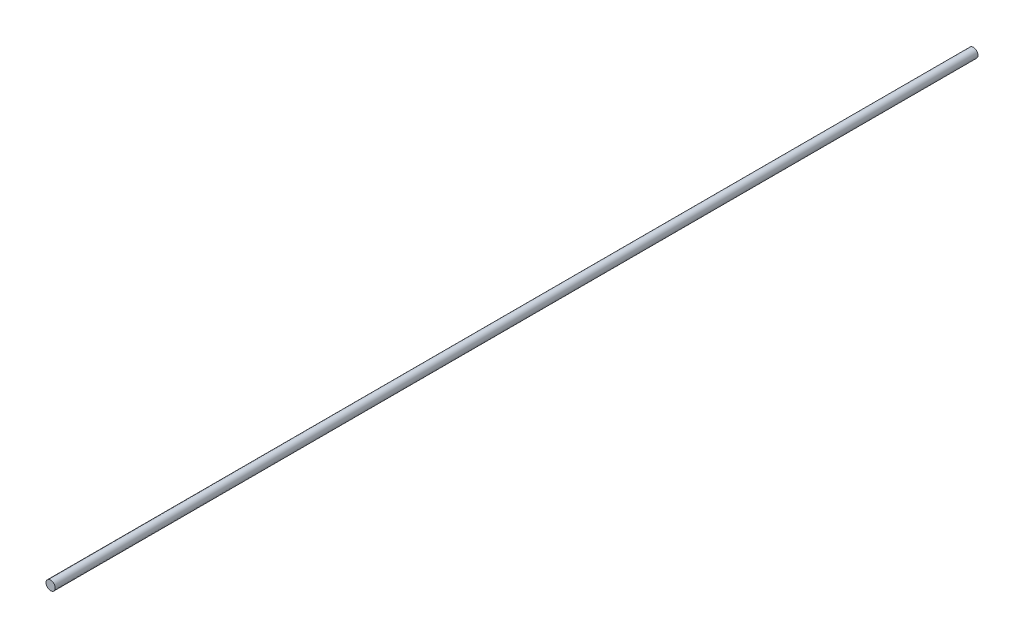
ISO-10303-21;
HEADER;
FILE_DESCRIPTION(('STEP AP214'),'2;1');
FILE_NAME('part.step','',(''),(''),'','','');
FILE_SCHEMA(('AUTOMOTIVE_DESIGN { 1 0 10303 214 1 1 1 1 }'));
ENDSEC;
DATA;
#1=APPLICATION_CONTEXT('core data for automotive mechanical design processes');
#2=APPLICATION_PROTOCOL_DEFINITION('international standard','automotive_design',2000,#1);
#3=PRODUCT_CONTEXT('',#1,'mechanical');
#4=PRODUCT('Part','Part','',(#3));
#5=PRODUCT_RELATED_PRODUCT_CATEGORY('part','',(#4));
#6=PRODUCT_DEFINITION_FORMATION('','',#4);
#7=PRODUCT_DEFINITION_CONTEXT('part definition',#1,'design');
#8=PRODUCT_DEFINITION('design','',#6,#7);
#9=PRODUCT_DEFINITION_SHAPE('','',#8);
#10=(LENGTH_UNIT() NAMED_UNIT(*) SI_UNIT(.MILLI.,.METRE.));
#11=(NAMED_UNIT(*) PLANE_ANGLE_UNIT() SI_UNIT($,.RADIAN.));
#12=(NAMED_UNIT(*) SI_UNIT($,.STERADIAN.) SOLID_ANGLE_UNIT());
#13=UNCERTAINTY_MEASURE_WITH_UNIT(LENGTH_MEASURE(1.E-05),#10,'distance_accuracy_value','');
#14=(GEOMETRIC_REPRESENTATION_CONTEXT(3) GLOBAL_UNCERTAINTY_ASSIGNED_CONTEXT((#13)) GLOBAL_UNIT_ASSIGNED_CONTEXT((#10,
#11,#12)) REPRESENTATION_CONTEXT('',''));
#15=CARTESIAN_POINT('',(0.,0.,0.));
#16=DIRECTION('',(0.,0.,1.));
#17=DIRECTION('',(1.,0.,0.));
#18=AXIS2_PLACEMENT_3D('',#15,#16,#17);
#19=CARTESIAN_POINT('',(0.,0.,300.));
#20=DIRECTION('',(0.,0.,-1.));
#21=DIRECTION('',(-1.,0.,0.));
#22=AXIS2_PLACEMENT_3D('',#19,#20,#21);
#23=CYLINDRICAL_SURFACE('',#22,1.5);
#24=CARTESIAN_POINT('',(0.,0.,300.));
#25=DIRECTION('',(0.,0.,1.));
#26=DIRECTION('',(1.,0.,0.));
#27=AXIS2_PLACEMENT_3D('',#24,#25,#26);
#28=CIRCLE('',#27,1.5);
#29=CARTESIAN_POINT('',(1.5,0.,300.));
#30=VERTEX_POINT('',#29);
#31=EDGE_CURVE('E10',#30,#30,#28,.T.);
#32=ORIENTED_EDGE('',*,*,#31,.F.);
#33=EDGE_LOOP('',(#32));
#34=FACE_BOUND('',#33,.T.);
#35=CARTESIAN_POINT('',(0.,0.,0.));
#36=DIRECTION('',(0.,0.,1.));
#37=DIRECTION('',(1.,0.,0.));
#38=AXIS2_PLACEMENT_3D('',#35,#36,#37);
#39=CIRCLE('',#38,1.5);
#40=CARTESIAN_POINT('',(1.5,0.,0.));
#41=VERTEX_POINT('',#40);
#42=EDGE_CURVE('E42',#41,#41,#39,.T.);
#43=ORIENTED_EDGE('',*,*,#42,.T.);
#44=EDGE_LOOP('',(#43));
#45=FACE_BOUND('',#44,.T.);
#46=ADVANCED_FACE('F39',(#34,#45),#23,.T.);
#47=CARTESIAN_POINT('',(0.,0.,300.));
#48=DIRECTION('',(0.,0.,1.));
#49=DIRECTION('',(1.,0.,0.));
#50=AXIS2_PLACEMENT_3D('',#47,#48,#49);
#51=PLANE('',#50);
#52=ORIENTED_EDGE('',*,*,#31,.T.);
#53=EDGE_LOOP('',(#52));
#54=FACE_BOUND('',#53,.T.);
#55=ADVANCED_FACE('F54',(#54),#51,.T.);
#56=CARTESIAN_POINT('',(0.,0.,0.));
#57=DIRECTION('',(0.,0.,1.));
#58=DIRECTION('',(1.,0.,0.));
#59=AXIS2_PLACEMENT_3D('',#56,#57,#58);
#60=PLANE('',#59);
#61=ORIENTED_EDGE('',*,*,#42,.F.);
#62=EDGE_LOOP('',(#61));
#63=FACE_BOUND('',#62,.T.);
#64=ADVANCED_FACE('F52',(#63),#60,.F.);
#65=CLOSED_SHELL('',(#46,#55,#64));
#66=MANIFOLD_SOLID_BREP('B2',#65);
#67=ADVANCED_BREP_SHAPE_REPRESENTATION('',(#18,#66),#14);
#68=SHAPE_DEFINITION_REPRESENTATION(#9,#67);
ENDSEC;
END-ISO-10303-21;
